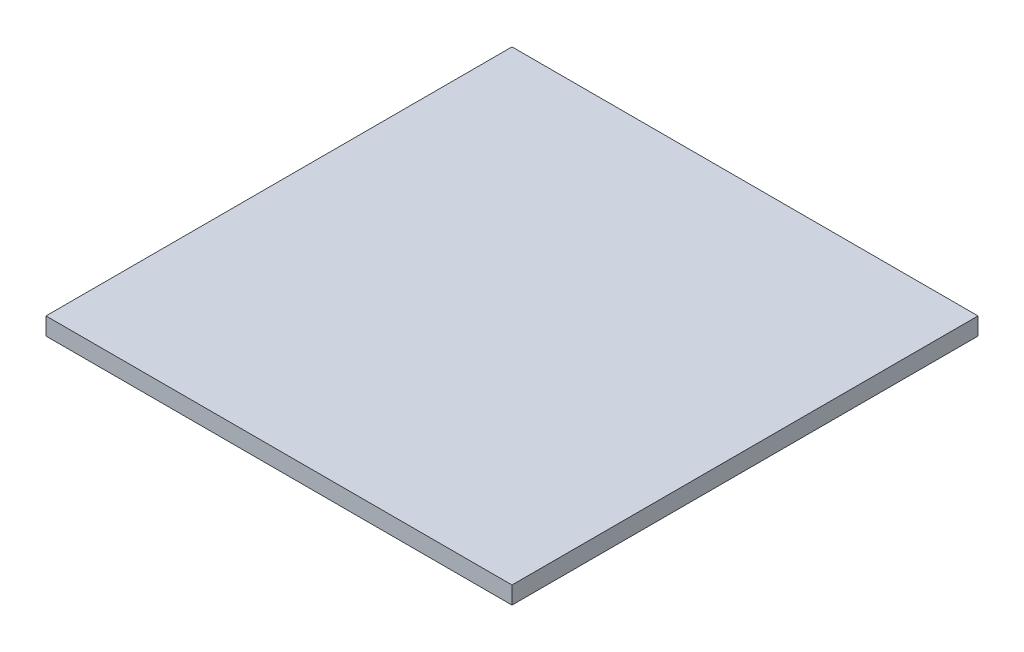
ISO-10303-21;
HEADER;
FILE_DESCRIPTION(('STEP AP214'),'2;1');
FILE_NAME('part.step','',(''),(''),'','','');
FILE_SCHEMA(('AUTOMOTIVE_DESIGN { 1 0 10303 214 1 1 1 1 }'));
ENDSEC;
DATA;
#1=APPLICATION_CONTEXT('core data for automotive mechanical design processes');
#2=APPLICATION_PROTOCOL_DEFINITION('international standard','automotive_design',2000,#1);
#3=PRODUCT_CONTEXT('',#1,'mechanical');
#4=PRODUCT('Part','Part','',(#3));
#5=PRODUCT_RELATED_PRODUCT_CATEGORY('part','',(#4));
#6=PRODUCT_DEFINITION_FORMATION('','',#4);
#7=PRODUCT_DEFINITION_CONTEXT('part definition',#1,'design');
#8=PRODUCT_DEFINITION('design','',#6,#7);
#9=PRODUCT_DEFINITION_SHAPE('','',#8);
#10=(LENGTH_UNIT() NAMED_UNIT(*) SI_UNIT(.MILLI.,.METRE.));
#11=(NAMED_UNIT(*) PLANE_ANGLE_UNIT() SI_UNIT($,.RADIAN.));
#12=(NAMED_UNIT(*) SI_UNIT($,.STERADIAN.) SOLID_ANGLE_UNIT());
#13=UNCERTAINTY_MEASURE_WITH_UNIT(LENGTH_MEASURE(1.E-05),#10,'distance_accuracy_value','');
#14=(GEOMETRIC_REPRESENTATION_CONTEXT(3) GLOBAL_UNCERTAINTY_ASSIGNED_CONTEXT((#13)) GLOBAL_UNIT_ASSIGNED_CONTEXT((#10,
#11,#12)) REPRESENTATION_CONTEXT('',''));
#15=CARTESIAN_POINT('',(0.,0.,0.));
#16=DIRECTION('',(0.,0.,1.));
#17=DIRECTION('',(1.,0.,0.));
#18=AXIS2_PLACEMENT_3D('',#15,#16,#17);
#19=CARTESIAN_POINT('',(-40.,3.,40.));
#20=DIRECTION('',(0.,0.,-1.));
#21=DIRECTION('',(-1.,0.,0.));
#22=AXIS2_PLACEMENT_3D('',#19,#20,#21);
#23=PLANE('',#22);
#24=DIRECTION('',(1.,0.,0.));
#25=VECTOR('',#24,1.);
#26=CARTESIAN_POINT('',(-40.,0.,40.));
#27=LINE('',#26,#25);
#28=CARTESIAN_POINT('',(-40.,0.,40.));
#29=VERTEX_POINT('',#28);
#30=CARTESIAN_POINT('',(40.,0.,40.));
#31=VERTEX_POINT('',#30);
#32=EDGE_CURVE('E108',#29,#31,#27,.T.);
#33=ORIENTED_EDGE('',*,*,#32,.T.);
#34=DIRECTION('',(0.,-1.,0.));
#35=VECTOR('',#34,1.);
#36=CARTESIAN_POINT('',(40.,3.,40.));
#37=LINE('',#36,#35);
#38=CARTESIAN_POINT('',(40.,3.,40.));
#39=VERTEX_POINT('',#38);
#40=EDGE_CURVE('E11',#39,#31,#37,.T.);
#41=ORIENTED_EDGE('',*,*,#40,.F.);
#42=DIRECTION('',(1.,0.,0.));
#43=VECTOR('',#42,1.);
#44=CARTESIAN_POINT('',(-40.,3.,40.));
#45=LINE('',#44,#43);
#46=CARTESIAN_POINT('',(-40.,3.,40.));
#47=VERTEX_POINT('',#46);
#48=EDGE_CURVE('E81',#47,#39,#45,.T.);
#49=ORIENTED_EDGE('',*,*,#48,.F.);
#50=DIRECTION('',(0.,-1.,0.));
#51=VECTOR('',#50,1.);
#52=CARTESIAN_POINT('',(-40.,3.,40.));
#53=LINE('',#52,#51);
#54=EDGE_CURVE('E104',#47,#29,#53,.T.);
#55=ORIENTED_EDGE('',*,*,#54,.T.);
#56=EDGE_LOOP('',(#33,#41,#49,#55));
#57=FACE_BOUND('',#56,.T.);
#58=ADVANCED_FACE('F41',(#57),#23,.F.);
#59=CARTESIAN_POINT('',(40.,3.,-40.));
#60=DIRECTION('',(1.,0.,0.));
#61=DIRECTION('',(0.,0.,-1.));
#62=AXIS2_PLACEMENT_3D('',#59,#60,#61);
#63=PLANE('',#62);
#64=DIRECTION('',(0.,0.,1.));
#65=VECTOR('',#64,1.);
#66=CARTESIAN_POINT('',(40.,0.,-40.));
#67=LINE('',#66,#65);
#68=CARTESIAN_POINT('',(40.,0.,-40.));
#69=VERTEX_POINT('',#68);
#70=EDGE_CURVE('E90',#69,#31,#67,.T.);
#71=ORIENTED_EDGE('',*,*,#70,.F.);
#72=DIRECTION('',(0.,-1.,0.));
#73=VECTOR('',#72,1.);
#74=CARTESIAN_POINT('',(40.,3.,-40.));
#75=LINE('',#74,#73);
#76=CARTESIAN_POINT('',(40.,3.,-40.));
#77=VERTEX_POINT('',#76);
#78=EDGE_CURVE('E50',#77,#69,#75,.T.);
#79=ORIENTED_EDGE('',*,*,#78,.F.);
#80=DIRECTION('',(0.,0.,1.));
#81=VECTOR('',#80,1.);
#82=CARTESIAN_POINT('',(40.,3.,-40.));
#83=LINE('',#82,#81);
#84=EDGE_CURVE('E88',#77,#39,#83,.T.);
#85=ORIENTED_EDGE('',*,*,#84,.T.);
#86=ORIENTED_EDGE('',*,*,#40,.T.);
#87=EDGE_LOOP('',(#71,#79,#85,#86));
#88=FACE_BOUND('',#87,.T.);
#89=ADVANCED_FACE('F87',(#88),#63,.T.);
#90=CARTESIAN_POINT('',(-40.,3.,-40.));
#91=DIRECTION('',(0.,0.,-1.));
#92=DIRECTION('',(-1.,0.,0.));
#93=AXIS2_PLACEMENT_3D('',#90,#91,#92);
#94=PLANE('',#93);
#95=DIRECTION('',(1.,0.,0.));
#96=VECTOR('',#95,1.);
#97=CARTESIAN_POINT('',(-40.,0.,-40.));
#98=LINE('',#97,#96);
#99=CARTESIAN_POINT('',(-40.,0.,-40.));
#100=VERTEX_POINT('',#99);
#101=EDGE_CURVE('E114',#100,#69,#98,.T.);
#102=ORIENTED_EDGE('',*,*,#101,.F.);
#103=DIRECTION('',(0.,-1.,0.));
#104=VECTOR('',#103,1.);
#105=CARTESIAN_POINT('',(-40.,3.,-40.));
#106=LINE('',#105,#104);
#107=CARTESIAN_POINT('',(-40.,3.,-40.));
#108=VERTEX_POINT('',#107);
#109=EDGE_CURVE('E73',#108,#100,#106,.T.);
#110=ORIENTED_EDGE('',*,*,#109,.F.);
#111=DIRECTION('',(1.,0.,0.));
#112=VECTOR('',#111,1.);
#113=CARTESIAN_POINT('',(-40.,3.,-40.));
#114=LINE('',#113,#112);
#115=EDGE_CURVE('E97',#108,#77,#114,.T.);
#116=ORIENTED_EDGE('',*,*,#115,.T.);
#117=ORIENTED_EDGE('',*,*,#78,.T.);
#118=EDGE_LOOP('',(#102,#110,#116,#117));
#119=FACE_BOUND('',#118,.T.);
#120=ADVANCED_FACE('F100',(#119),#94,.T.);
#121=CARTESIAN_POINT('',(-40.,3.,-40.));
#122=DIRECTION('',(1.,0.,0.));
#123=DIRECTION('',(0.,0.,-1.));
#124=AXIS2_PLACEMENT_3D('',#121,#122,#123);
#125=PLANE('',#124);
#126=DIRECTION('',(0.,0.,1.));
#127=VECTOR('',#126,1.);
#128=CARTESIAN_POINT('',(-40.,0.,-40.));
#129=LINE('',#128,#127);
#130=EDGE_CURVE('E76',#100,#29,#129,.T.);
#131=ORIENTED_EDGE('',*,*,#130,.T.);
#132=ORIENTED_EDGE('',*,*,#54,.F.);
#133=DIRECTION('',(0.,0.,1.));
#134=VECTOR('',#133,1.);
#135=CARTESIAN_POINT('',(-40.,3.,-40.));
#136=LINE('',#135,#134);
#137=EDGE_CURVE('E58',#108,#47,#136,.T.);
#138=ORIENTED_EDGE('',*,*,#137,.F.);
#139=ORIENTED_EDGE('',*,*,#109,.T.);
#140=EDGE_LOOP('',(#131,#132,#138,#139));
#141=FACE_BOUND('',#140,.T.);
#142=ADVANCED_FACE('F131',(#141),#125,.F.);
#143=CARTESIAN_POINT('',(0.,3.,0.));
#144=DIRECTION('',(0.,-1.,0.));
#145=DIRECTION('',(0.,0.,-1.));
#146=AXIS2_PLACEMENT_3D('',#143,#144,#145);
#147=PLANE('',#146);
#148=ORIENTED_EDGE('',*,*,#48,.T.);
#149=ORIENTED_EDGE('',*,*,#84,.F.);
#150=ORIENTED_EDGE('',*,*,#115,.F.);
#151=ORIENTED_EDGE('',*,*,#137,.T.);
#152=EDGE_LOOP('',(#148,#149,#150,#151));
#153=FACE_BOUND('',#152,.T.);
#154=ADVANCED_FACE('F96',(#153),#147,.F.);
#155=CARTESIAN_POINT('',(0.,0.,0.));
#156=DIRECTION('',(0.,-1.,0.));
#157=DIRECTION('',(0.,0.,-1.));
#158=AXIS2_PLACEMENT_3D('',#155,#156,#157);
#159=PLANE('',#158);
#160=ORIENTED_EDGE('',*,*,#32,.F.);
#161=ORIENTED_EDGE('',*,*,#130,.F.);
#162=ORIENTED_EDGE('',*,*,#101,.T.);
#163=ORIENTED_EDGE('',*,*,#70,.T.);
#164=EDGE_LOOP('',(#160,#161,#162,#163));
#165=FACE_BOUND('',#164,.T.);
#166=ADVANCED_FACE('F125',(#165),#159,.T.);
#167=CLOSED_SHELL('',(#58,#89,#120,#142,#154,#166));
#168=MANIFOLD_SOLID_BREP('B2',#167);
#169=ADVANCED_BREP_SHAPE_REPRESENTATION('',(#18,#168),#14);
#170=SHAPE_DEFINITION_REPRESENTATION(#9,#169);
ENDSEC;
END-ISO-10303-21;
